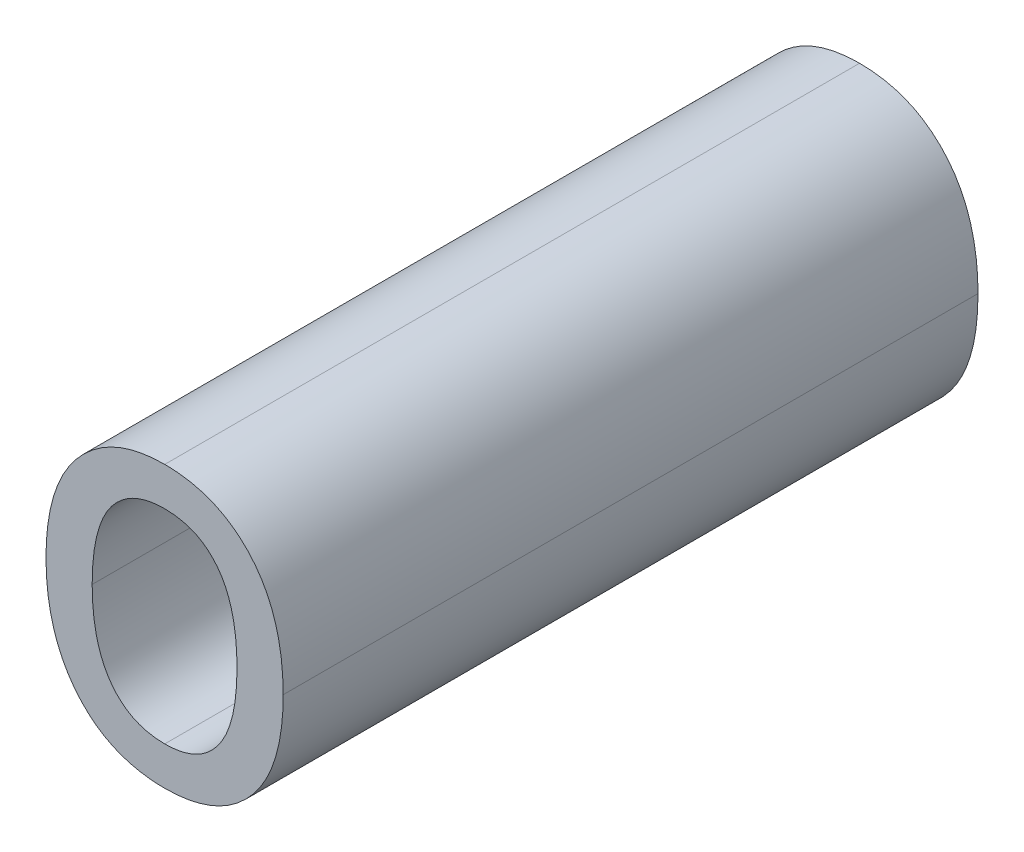
ISO-10303-21;
HEADER;
FILE_DESCRIPTION(('STEP AP214'),'2;1');
FILE_NAME('part.step','',(''),(''),'','','');
FILE_SCHEMA(('AUTOMOTIVE_DESIGN { 1 0 10303 214 1 1 1 1 }'));
ENDSEC;
DATA;
#1=APPLICATION_CONTEXT('core data for automotive mechanical design processes');
#2=APPLICATION_PROTOCOL_DEFINITION('international standard','automotive_design',2000,#1);
#3=PRODUCT_CONTEXT('',#1,'mechanical');
#4=PRODUCT('Part','Part','',(#3));
#5=PRODUCT_RELATED_PRODUCT_CATEGORY('part','',(#4));
#6=PRODUCT_DEFINITION_FORMATION('','',#4);
#7=PRODUCT_DEFINITION_CONTEXT('part definition',#1,'design');
#8=PRODUCT_DEFINITION('design','',#6,#7);
#9=PRODUCT_DEFINITION_SHAPE('','',#8);
#10=(LENGTH_UNIT() NAMED_UNIT(*) SI_UNIT(.MILLI.,.METRE.));
#11=(NAMED_UNIT(*) PLANE_ANGLE_UNIT() SI_UNIT($,.RADIAN.));
#12=(NAMED_UNIT(*) SI_UNIT($,.STERADIAN.) SOLID_ANGLE_UNIT());
#13=UNCERTAINTY_MEASURE_WITH_UNIT(LENGTH_MEASURE(1.E-05),#10,'distance_accuracy_value','');
#14=(GEOMETRIC_REPRESENTATION_CONTEXT(3) GLOBAL_UNCERTAINTY_ASSIGNED_CONTEXT((#13)) GLOBAL_UNIT_ASSIGNED_CONTEXT((#10,
#11,#12)) REPRESENTATION_CONTEXT('',''));
#15=CARTESIAN_POINT('',(0.,0.,0.));
#16=DIRECTION('',(0.,0.,1.));
#17=DIRECTION('',(1.,0.,0.));
#18=AXIS2_PLACEMENT_3D('',#15,#16,#17);
#19=CARTESIAN_POINT('',(-1.961285671734,-1.901428991533,0.));
#20=CARTESIAN_POINT('',(-1.961285671734,-1.901428991533,0.1));
#21=CARTESIAN_POINT('',(-1.956332462357,-1.901428991533,0.));
#22=CARTESIAN_POINT('',(-1.956332462357,-1.901428991533,0.1));
#23=CARTESIAN_POINT('',(-1.950883932042,-1.894123007702,0.));
#24=CARTESIAN_POINT('',(-1.950883932042,-1.894123007702,0.1));
#25=CARTESIAN_POINT('',(-1.950883932042,-1.886775747126,0.));
#26=CARTESIAN_POINT('',(-1.950883932042,-1.886775747126,0.1));
#27=B_SPLINE_SURFACE_WITH_KNOTS('',2,1,((#19,#20),(#21,#22),(#23,#24),(#25,#26)),.UNSPECIFIED.,
.F.,.F.,.F.,(3,1,3),(2,2),(0.,1.,2.),(0.,0.01),.UNSPECIFIED.);
#28=CARTESIAN_POINT('',(-1.961285671734,-1.901428991533,0.));
#29=CARTESIAN_POINT('',(-1.956332462357,-1.901428991533,0.));
#30=CARTESIAN_POINT('',(-1.950883932042,-1.894123007702,0.));
#31=CARTESIAN_POINT('',(-1.950883932042,-1.886775747126,0.));
#32=B_SPLINE_CURVE_WITH_KNOTS('',2,(#28,#29,#30,#31),.UNSPECIFIED.,.F.,.F.,(3,1,3),(0.,1.,2.),.UNSPECIFIED.);
#33=CARTESIAN_POINT('',(-1.961285671734,-1.901428991533,0.));
#34=VERTEX_POINT('',#33);
#35=CARTESIAN_POINT('',(-1.950883932042,-1.886775747126,0.));
#36=VERTEX_POINT('',#35);
#37=EDGE_CURVE('E11',#34,#36,#32,.T.);
#38=DIRECTION('',(0.,0.,1.));
#39=VECTOR('',#38,1.);
#40=CARTESIAN_POINT('',(-1.961285671734,-1.901428991533,0.));
#41=LINE('',#40,#39);
#42=CARTESIAN_POINT('',(-1.961285671734,-1.901428991533,0.1));
#43=VERTEX_POINT('',#42);
#44=EDGE_CURVE('E28',#34,#43,#41,.T.);
#45=CARTESIAN_POINT('',(-1.950883932042,-1.886775747126,0.1));
#46=CARTESIAN_POINT('',(-1.950883932042,-1.894123007702,0.1));
#47=CARTESIAN_POINT('',(-1.956332462357,-1.901428991533,0.1));
#48=CARTESIAN_POINT('',(-1.961285671734,-1.901428991533,0.1));
#49=B_SPLINE_CURVE_WITH_KNOTS('',2,(#45,#46,#47,#48),.UNSPECIFIED.,.F.,.F.,(3,1,3),(-2.,-1.,0.),.UNSPECIFIED.);
#50=CARTESIAN_POINT('',(-1.950883932042,-1.886775747126,0.1));
#51=VERTEX_POINT('',#50);
#52=EDGE_CURVE('E221',#51,#43,#49,.T.);
#53=DIRECTION('',(0.,0.,1.));
#54=VECTOR('',#53,1.);
#55=CARTESIAN_POINT('',(-1.950883932042,-1.886775747126,0.));
#56=LINE('',#55,#54);
#57=EDGE_CURVE('E41',#36,#51,#56,.T.);
#58=ORIENTED_EDGE('',*,*,#37,.F.);
#59=ORIENTED_EDGE('',*,*,#44,.T.);
#60=ORIENTED_EDGE('',*,*,#52,.F.);
#61=ORIENTED_EDGE('',*,*,#57,.F.);
#62=EDGE_LOOP('',(#58,#59,#60,#61));
#63=FACE_BOUND('',#62,.T.);
#64=ADVANCED_FACE('F17',(#63),#27,.F.);
#65=CARTESIAN_POINT('',(-1.971728688171,-1.886775747126,0.));
#66=CARTESIAN_POINT('',(-1.971728688171,-1.886775747126,0.1));
#67=CARTESIAN_POINT('',(-1.971728688171,-1.893999177468,0.));
#68=CARTESIAN_POINT('',(-1.971728688171,-1.893999177468,0.1));
#69=CARTESIAN_POINT('',(-1.966280157856,-1.901428991533,0.));
#70=CARTESIAN_POINT('',(-1.966280157856,-1.901428991533,0.1));
#71=CARTESIAN_POINT('',(-1.961285671734,-1.901428991533,0.));
#72=CARTESIAN_POINT('',(-1.961285671734,-1.901428991533,0.1));
#73=B_SPLINE_SURFACE_WITH_KNOTS('',2,1,((#65,#66),(#67,#68),(#69,#70),(#71,#72)),.UNSPECIFIED.,
.F.,.F.,.F.,(3,1,3),(2,2),(0.,1.,2.),(0.,0.01),.UNSPECIFIED.);
#74=CARTESIAN_POINT('',(-1.971728688171,-1.886775747126,0.));
#75=CARTESIAN_POINT('',(-1.971728688171,-1.893999177468,0.));
#76=CARTESIAN_POINT('',(-1.966280157856,-1.901428991533,0.));
#77=CARTESIAN_POINT('',(-1.961285671734,-1.901428991533,0.));
#78=B_SPLINE_CURVE_WITH_KNOTS('',2,(#74,#75,#76,#77),.UNSPECIFIED.,.F.,.F.,(3,1,3),(0.,1.,2.),.UNSPECIFIED.);
#79=CARTESIAN_POINT('',(-1.971728688171,-1.886775747126,0.));
#80=VERTEX_POINT('',#79);
#81=EDGE_CURVE('E212',#80,#34,#78,.T.);
#82=DIRECTION('',(0.,0.,1.));
#83=VECTOR('',#82,1.);
#84=CARTESIAN_POINT('',(-1.971728688171,-1.886775747126,0.));
#85=LINE('',#84,#83);
#86=CARTESIAN_POINT('',(-1.971728688171,-1.886775747126,0.1));
#87=VERTEX_POINT('',#86);
#88=EDGE_CURVE('E206',#80,#87,#85,.T.);
#89=CARTESIAN_POINT('',(-1.961285671734,-1.901428991533,0.1));
#90=CARTESIAN_POINT('',(-1.966280157856,-1.901428991533,0.1));
#91=CARTESIAN_POINT('',(-1.971728688171,-1.893999177468,0.1));
#92=CARTESIAN_POINT('',(-1.971728688171,-1.886775747126,0.1));
#93=B_SPLINE_CURVE_WITH_KNOTS('',2,(#89,#90,#91,#92),.UNSPECIFIED.,.F.,.F.,(3,1,3),(-2.,-1.,0.),.UNSPECIFIED.);
#94=EDGE_CURVE('E199',#43,#87,#93,.T.);
#95=ORIENTED_EDGE('',*,*,#81,.F.);
#96=ORIENTED_EDGE('',*,*,#88,.T.);
#97=ORIENTED_EDGE('',*,*,#94,.F.);
#98=ORIENTED_EDGE('',*,*,#44,.F.);
#99=EDGE_LOOP('',(#95,#96,#97,#98));
#100=FACE_BOUND('',#99,.T.);
#101=ADVANCED_FACE('F227',(#100),#73,.F.);
#102=CARTESIAN_POINT('',(-1.961285671734,-1.872122502718,0.));
#103=CARTESIAN_POINT('',(-1.961285671734,-1.872122502718,0.1));
#104=CARTESIAN_POINT('',(-1.966280157856,-1.872122502718,0.));
#105=CARTESIAN_POINT('',(-1.966280157856,-1.872122502718,0.1));
#106=CARTESIAN_POINT('',(-1.971728688171,-1.87934593306,0.));
#107=CARTESIAN_POINT('',(-1.971728688171,-1.87934593306,0.1));
#108=CARTESIAN_POINT('',(-1.971728688171,-1.886775747126,0.));
#109=CARTESIAN_POINT('',(-1.971728688171,-1.886775747126,0.1));
#110=B_SPLINE_SURFACE_WITH_KNOTS('',2,1,((#102,#103),(#104,#105),(#106,#107),(#108,#109)),
.UNSPECIFIED.,.F.,.F.,.F.,(3,1,3),(2,2),(0.,1.,2.),(0.,0.01),.UNSPECIFIED.);
#111=CARTESIAN_POINT('',(-1.961285671734,-1.872122502718,0.));
#112=CARTESIAN_POINT('',(-1.966280157856,-1.872122502718,0.));
#113=CARTESIAN_POINT('',(-1.971728688171,-1.87934593306,0.));
#114=CARTESIAN_POINT('',(-1.971728688171,-1.886775747126,0.));
#115=B_SPLINE_CURVE_WITH_KNOTS('',2,(#111,#112,#113,#114),.UNSPECIFIED.,.F.,.F.,(3,1,3),(0.,1.,
2.),.UNSPECIFIED.);
#116=CARTESIAN_POINT('',(-1.961285671734,-1.872122502718,0.));
#117=VERTEX_POINT('',#116);
#118=EDGE_CURVE('E194',#117,#80,#115,.T.);
#119=DIRECTION('',(0.,0.,1.));
#120=VECTOR('',#119,1.);
#121=CARTESIAN_POINT('',(-1.961285671734,-1.872122502718,0.));
#122=LINE('',#121,#120);
#123=CARTESIAN_POINT('',(-1.961285671734,-1.872122502718,0.1));
#124=VERTEX_POINT('',#123);
#125=EDGE_CURVE('E188',#117,#124,#122,.T.);
#126=CARTESIAN_POINT('',(-1.971728688171,-1.886775747126,0.1));
#127=CARTESIAN_POINT('',(-1.971728688171,-1.87934593306,0.1));
#128=CARTESIAN_POINT('',(-1.966280157856,-1.872122502718,0.1));
#129=CARTESIAN_POINT('',(-1.961285671734,-1.872122502718,0.1));
#130=B_SPLINE_CURVE_WITH_KNOTS('',2,(#126,#127,#128,#129),.UNSPECIFIED.,.F.,.F.,(3,1,3),(-2.,
-1.,0.),.UNSPECIFIED.);
#131=EDGE_CURVE('E181',#87,#124,#130,.T.);
#132=ORIENTED_EDGE('',*,*,#118,.F.);
#133=ORIENTED_EDGE('',*,*,#125,.T.);
#134=ORIENTED_EDGE('',*,*,#131,.F.);
#135=ORIENTED_EDGE('',*,*,#88,.F.);
#136=EDGE_LOOP('',(#132,#133,#134,#135));
#137=FACE_BOUND('',#136,.T.);
#138=ADVANCED_FACE('F237',(#137),#110,.F.);
#139=CARTESIAN_POINT('',(-1.950883932042,-1.886775747126,0.));
#140=CARTESIAN_POINT('',(-1.950883932042,-1.886775747126,0.1));
#141=CARTESIAN_POINT('',(-1.950883932042,-1.87934593306,0.));
#142=CARTESIAN_POINT('',(-1.950883932042,-1.87934593306,0.1));
#143=CARTESIAN_POINT('',(-1.956291185612,-1.872122502718,0.));
#144=CARTESIAN_POINT('',(-1.956291185612,-1.872122502718,0.1));
#145=CARTESIAN_POINT('',(-1.961285671734,-1.872122502718,0.));
#146=CARTESIAN_POINT('',(-1.961285671734,-1.872122502718,0.1));
#147=B_SPLINE_SURFACE_WITH_KNOTS('',2,1,((#139,#140),(#141,#142),(#143,#144),(#145,#146)),
.UNSPECIFIED.,.F.,.F.,.F.,(3,1,3),(2,2),(0.,1.,2.),(0.,0.01),.UNSPECIFIED.);
#148=CARTESIAN_POINT('',(-1.950883932042,-1.886775747126,0.));
#149=CARTESIAN_POINT('',(-1.950883932042,-1.87934593306,0.));
#150=CARTESIAN_POINT('',(-1.956291185612,-1.872122502718,0.));
#151=CARTESIAN_POINT('',(-1.961285671734,-1.872122502718,0.));
#152=B_SPLINE_CURVE_WITH_KNOTS('',2,(#148,#149,#150,#151),.UNSPECIFIED.,.F.,.F.,(3,1,3),(0.,1.,
2.),.UNSPECIFIED.);
#153=EDGE_CURVE('E173',#36,#117,#152,.T.);
#154=CARTESIAN_POINT('',(-1.961285671734,-1.872122502718,0.1));
#155=CARTESIAN_POINT('',(-1.956291185612,-1.872122502718,0.1));
#156=CARTESIAN_POINT('',(-1.950883932042,-1.87934593306,0.1));
#157=CARTESIAN_POINT('',(-1.950883932042,-1.886775747126,0.1));
#158=B_SPLINE_CURVE_WITH_KNOTS('',2,(#154,#155,#156,#157),.UNSPECIFIED.,.F.,.F.,(3,1,3),(-2.,
-1.,0.),.UNSPECIFIED.);
#159=EDGE_CURVE('E165',#124,#51,#158,.T.);
#160=ORIENTED_EDGE('',*,*,#153,.F.);
#161=ORIENTED_EDGE('',*,*,#57,.T.);
#162=ORIENTED_EDGE('',*,*,#159,.F.);
#163=ORIENTED_EDGE('',*,*,#125,.F.);
#164=EDGE_LOOP('',(#160,#161,#162,#163));
#165=FACE_BOUND('',#164,.T.);
#166=ADVANCED_FACE('F232',(#165),#147,.F.);
#167=CARTESIAN_POINT('',(-1.978374244085,-1.886775747126,0.));
#168=CARTESIAN_POINT('',(-1.978374244085,-1.886775747126,0.1));
#169=CARTESIAN_POINT('',(-1.978374244085,-1.896104291453,0.));
#170=CARTESIAN_POINT('',(-1.978374244085,-1.896104291453,0.1));
#171=CARTESIAN_POINT('',(-1.969252083482,-1.906960075338,0.));
#172=CARTESIAN_POINT('',(-1.969252083482,-1.906960075338,0.1));
#173=CARTESIAN_POINT('',(-1.961285671734,-1.906960075338,0.));
#174=CARTESIAN_POINT('',(-1.961285671734,-1.906960075338,0.1));
#175=B_SPLINE_SURFACE_WITH_KNOTS('',2,1,((#167,#168),(#169,#170),(#171,#172),(#173,#174)),
.UNSPECIFIED.,.F.,.F.,.F.,(3,1,3),(2,2),(-2.,-1.,0.),(0.,0.01),.UNSPECIFIED.);
#176=CARTESIAN_POINT('',(-1.961285671734,-1.906960075338,0.));
#177=CARTESIAN_POINT('',(-1.969252083482,-1.906960075338,0.));
#178=CARTESIAN_POINT('',(-1.978374244085,-1.896104291453,0.));
#179=CARTESIAN_POINT('',(-1.978374244085,-1.886775747126,0.));
#180=B_SPLINE_CURVE_WITH_KNOTS('',2,(#176,#177,#178,#179),.UNSPECIFIED.,.F.,.F.,(3,1,3),(0.,1.,
2.),.UNSPECIFIED.);
#181=CARTESIAN_POINT('',(-1.961285671734,-1.906960075338,0.));
#182=VERTEX_POINT('',#181);
#183=CARTESIAN_POINT('',(-1.978374244085,-1.886775747126,0.));
#184=VERTEX_POINT('',#183);
#185=EDGE_CURVE('E161',#182,#184,#180,.T.);
#186=DIRECTION('',(0.,0.,1.));
#187=VECTOR('',#186,1.);
#188=CARTESIAN_POINT('',(-1.961285671734,-1.906960075338,0.));
#189=LINE('',#188,#187);
#190=CARTESIAN_POINT('',(-1.961285671734,-1.906960075338,0.1));
#191=VERTEX_POINT('',#190);
#192=EDGE_CURVE('E156',#182,#191,#189,.T.);
#193=CARTESIAN_POINT('',(-1.978374244085,-1.886775747126,0.1));
#194=CARTESIAN_POINT('',(-1.978374244085,-1.896104291453,0.1));
#195=CARTESIAN_POINT('',(-1.969252083482,-1.906960075338,0.1));
#196=CARTESIAN_POINT('',(-1.961285671734,-1.906960075338,0.1));
#197=B_SPLINE_CURVE_WITH_KNOTS('',2,(#193,#194,#195,#196),.UNSPECIFIED.,.F.,.F.,(3,1,3),(-2.,
-1.,0.),.UNSPECIFIED.);
#198=CARTESIAN_POINT('',(-1.978374244085,-1.886775747126,0.1));
#199=VERTEX_POINT('',#198);
#200=EDGE_CURVE('E110',#199,#191,#197,.T.);
#201=DIRECTION('',(0.,0.,1.));
#202=VECTOR('',#201,1.);
#203=CARTESIAN_POINT('',(-1.978374244085,-1.886775747126,0.));
#204=LINE('',#203,#202);
#205=EDGE_CURVE('E147',#184,#199,#204,.T.);
#206=ORIENTED_EDGE('',*,*,#185,.F.);
#207=ORIENTED_EDGE('',*,*,#192,.T.);
#208=ORIENTED_EDGE('',*,*,#200,.F.);
#209=ORIENTED_EDGE('',*,*,#205,.F.);
#210=EDGE_LOOP('',(#206,#207,#208,#209));
#211=FACE_BOUND('',#210,.T.);
#212=ADVANCED_FACE('F245',(#211),#175,.T.);
#213=CARTESIAN_POINT('',(-1.961285671734,-1.866591418914,0.));
#214=CARTESIAN_POINT('',(-1.961285671734,-1.866591418914,0.1));
#215=CARTESIAN_POINT('',(-1.968963146269,-1.866591418914,0.));
#216=CARTESIAN_POINT('',(-1.968963146269,-1.866591418914,0.1));
#217=CARTESIAN_POINT('',(-1.978374244085,-1.87719954233,0.));
#218=CARTESIAN_POINT('',(-1.978374244085,-1.87719954233,0.1));
#219=CARTESIAN_POINT('',(-1.978374244085,-1.886775747126,0.));
#220=CARTESIAN_POINT('',(-1.978374244085,-1.886775747126,0.1));
#221=B_SPLINE_SURFACE_WITH_KNOTS('',2,1,((#213,#214),(#215,#216),(#217,#218),(#219,#220)),
.UNSPECIFIED.,.F.,.F.,.F.,(3,1,3),(2,2),(-2.,-1.,0.),(0.,0.01),.UNSPECIFIED.);
#222=CARTESIAN_POINT('',(-1.978374244085,-1.886775747126,0.));
#223=CARTESIAN_POINT('',(-1.978374244085,-1.87719954233,0.));
#224=CARTESIAN_POINT('',(-1.968963146269,-1.866591418914,0.));
#225=CARTESIAN_POINT('',(-1.961285671734,-1.866591418914,0.));
#226=B_SPLINE_CURVE_WITH_KNOTS('',2,(#222,#223,#224,#225),.UNSPECIFIED.,.F.,.F.,(3,1,3),(0.,1.,
2.),.UNSPECIFIED.);
#227=CARTESIAN_POINT('',(-1.961285671734,-1.866591418914,0.));
#228=VERTEX_POINT('',#227);
#229=EDGE_CURVE('E140',#184,#228,#226,.T.);
#230=CARTESIAN_POINT('',(-1.961285671734,-1.866591418914,0.1));
#231=CARTESIAN_POINT('',(-1.968963146269,-1.866591418914,0.1));
#232=CARTESIAN_POINT('',(-1.978374244085,-1.87719954233,0.1));
#233=CARTESIAN_POINT('',(-1.978374244085,-1.886775747126,0.1));
#234=B_SPLINE_CURVE_WITH_KNOTS('',2,(#230,#231,#232,#233),.UNSPECIFIED.,.F.,.F.,(3,1,3),(-2.,
-1.,0.),.UNSPECIFIED.);
#235=CARTESIAN_POINT('',(-1.961285671734,-1.866591418914,0.1));
#236=VERTEX_POINT('',#235);
#237=EDGE_CURVE('E136',#236,#199,#234,.T.);
#238=DIRECTION('',(0.,0.,1.));
#239=VECTOR('',#238,1.);
#240=CARTESIAN_POINT('',(-1.961285671734,-1.866591418914,0.));
#241=LINE('',#240,#239);
#242=EDGE_CURVE('E93',#228,#236,#241,.T.);
#243=ORIENTED_EDGE('',*,*,#229,.F.);
#244=ORIENTED_EDGE('',*,*,#205,.T.);
#245=ORIENTED_EDGE('',*,*,#237,.F.);
#246=ORIENTED_EDGE('',*,*,#242,.F.);
#247=EDGE_LOOP('',(#243,#244,#245,#246));
#248=FACE_BOUND('',#247,.T.);
#249=ADVANCED_FACE('F283',(#248),#221,.T.);
#250=CARTESIAN_POINT('',(-1.944238376128,-1.886775747126,0.));
#251=CARTESIAN_POINT('',(-1.944238376128,-1.886775747126,0.1));
#252=CARTESIAN_POINT('',(-1.944238376128,-1.877158265585,0.));
#253=CARTESIAN_POINT('',(-1.944238376128,-1.877158265585,0.1));
#254=CARTESIAN_POINT('',(-1.95352564371,-1.866591418914,0.));
#255=CARTESIAN_POINT('',(-1.95352564371,-1.866591418914,0.1));
#256=CARTESIAN_POINT('',(-1.961285671734,-1.866591418914,0.));
#257=CARTESIAN_POINT('',(-1.961285671734,-1.866591418914,0.1));
#258=B_SPLINE_SURFACE_WITH_KNOTS('',2,1,((#250,#251),(#252,#253),(#254,#255),(#256,#257)),
.UNSPECIFIED.,.F.,.F.,.F.,(3,1,3),(2,2),(-2.,-1.,0.),(0.,0.01),.UNSPECIFIED.);
#259=CARTESIAN_POINT('',(-1.961285671734,-1.866591418914,0.));
#260=CARTESIAN_POINT('',(-1.95352564371,-1.866591418914,0.));
#261=CARTESIAN_POINT('',(-1.944238376128,-1.877158265585,0.));
#262=CARTESIAN_POINT('',(-1.944238376128,-1.886775747126,0.));
#263=B_SPLINE_CURVE_WITH_KNOTS('',2,(#259,#260,#261,#262),.UNSPECIFIED.,.F.,.F.,(3,1,3),(0.,1.,
2.),.UNSPECIFIED.);
#264=CARTESIAN_POINT('',(-1.944238376128,-1.886775747126,0.));
#265=VERTEX_POINT('',#264);
#266=EDGE_CURVE('E97',#228,#265,#263,.T.);
#267=CARTESIAN_POINT('',(-1.944238376128,-1.886775747126,0.1));
#268=CARTESIAN_POINT('',(-1.944238376128,-1.877158265585,0.1));
#269=CARTESIAN_POINT('',(-1.95352564371,-1.866591418914,0.1));
#270=CARTESIAN_POINT('',(-1.961285671734,-1.866591418914,0.1));
#271=B_SPLINE_CURVE_WITH_KNOTS('',2,(#267,#268,#269,#270),.UNSPECIFIED.,.F.,.F.,(3,1,3),(-2.,
-1.,0.),.UNSPECIFIED.);
#272=CARTESIAN_POINT('',(-1.944238376128,-1.886775747126,0.1));
#273=VERTEX_POINT('',#272);
#274=EDGE_CURVE('E86',#273,#236,#271,.T.);
#275=DIRECTION('',(0.,0.,1.));
#276=VECTOR('',#275,1.);
#277=CARTESIAN_POINT('',(-1.944238376128,-1.886775747126,0.));
#278=LINE('',#277,#276);
#279=EDGE_CURVE('E90',#265,#273,#278,.T.);
#280=ORIENTED_EDGE('',*,*,#266,.F.);
#281=ORIENTED_EDGE('',*,*,#242,.T.);
#282=ORIENTED_EDGE('',*,*,#274,.F.);
#283=ORIENTED_EDGE('',*,*,#279,.F.);
#284=EDGE_LOOP('',(#280,#281,#282,#283));
#285=FACE_BOUND('',#284,.T.);
#286=ADVANCED_FACE('F89',(#285),#258,.T.);
#287=CARTESIAN_POINT('',(-1.961285671734,-1.906960075338,0.));
#288=CARTESIAN_POINT('',(-1.961285671734,-1.906960075338,0.1));
#289=CARTESIAN_POINT('',(-1.95352564371,-1.906960075338,0.));
#290=CARTESIAN_POINT('',(-1.95352564371,-1.906960075338,0.1));
#291=CARTESIAN_POINT('',(-1.944238376128,-1.896434505411,0.));
#292=CARTESIAN_POINT('',(-1.944238376128,-1.896434505411,0.1));
#293=CARTESIAN_POINT('',(-1.944238376128,-1.886775747126,0.));
#294=CARTESIAN_POINT('',(-1.944238376128,-1.886775747126,0.1));
#295=B_SPLINE_SURFACE_WITH_KNOTS('',2,1,((#287,#288),(#289,#290),(#291,#292),(#293,#294)),
.UNSPECIFIED.,.F.,.F.,.F.,(3,1,3),(2,2),(-2.,-1.,0.),(0.,0.01),.UNSPECIFIED.);
#296=CARTESIAN_POINT('',(-1.944238376128,-1.886775747126,0.));
#297=CARTESIAN_POINT('',(-1.944238376128,-1.896434505411,0.));
#298=CARTESIAN_POINT('',(-1.95352564371,-1.906960075338,0.));
#299=CARTESIAN_POINT('',(-1.961285671734,-1.906960075338,0.));
#300=B_SPLINE_CURVE_WITH_KNOTS('',2,(#296,#297,#298,#299),.UNSPECIFIED.,.F.,.F.,(3,1,3),(0.,1.,
2.),.UNSPECIFIED.);
#301=EDGE_CURVE('E105',#265,#182,#300,.T.);
#302=CARTESIAN_POINT('',(-1.961285671734,-1.906960075338,0.1));
#303=CARTESIAN_POINT('',(-1.95352564371,-1.906960075338,0.1));
#304=CARTESIAN_POINT('',(-1.944238376128,-1.896434505411,0.1));
#305=CARTESIAN_POINT('',(-1.944238376128,-1.886775747126,0.1));
#306=B_SPLINE_CURVE_WITH_KNOTS('',2,(#302,#303,#304,#305),.UNSPECIFIED.,.F.,.F.,(3,1,3),(-2.,
-1.,0.),.UNSPECIFIED.);
#307=EDGE_CURVE('E103',#191,#273,#306,.T.);
#308=ORIENTED_EDGE('',*,*,#301,.F.);
#309=ORIENTED_EDGE('',*,*,#279,.T.);
#310=ORIENTED_EDGE('',*,*,#307,.F.);
#311=ORIENTED_EDGE('',*,*,#192,.F.);
#312=EDGE_LOOP('',(#308,#309,#310,#311));
#313=FACE_BOUND('',#312,.T.);
#314=ADVANCED_FACE('F101',(#313),#295,.T.);
#315=CARTESIAN_POINT('',(-1.961287809029,-1.886785469597,0.));
#316=DIRECTION('',(0.,0.,1.));
#317=DIRECTION('',(1.,0.,0.));
#318=AXIS2_PLACEMENT_3D('',#315,#316,#317);
#319=PLANE('',#318);
#320=ORIENTED_EDGE('',*,*,#301,.T.);
#321=ORIENTED_EDGE('',*,*,#185,.T.);
#322=ORIENTED_EDGE('',*,*,#229,.T.);
#323=ORIENTED_EDGE('',*,*,#266,.T.);
#324=EDGE_LOOP('',(#320,#321,#322,#323));
#325=FACE_BOUND('',#324,.T.);
#326=ORIENTED_EDGE('',*,*,#37,.T.);
#327=ORIENTED_EDGE('',*,*,#153,.T.);
#328=ORIENTED_EDGE('',*,*,#118,.T.);
#329=ORIENTED_EDGE('',*,*,#81,.T.);
#330=EDGE_LOOP('',(#326,#327,#328,#329));
#331=FACE_BOUND('',#330,.T.);
#332=ADVANCED_FACE('F235',(#325,#331),#319,.F.);
#333=CARTESIAN_POINT('',(-1.961287809029,-1.886785469597,0.1));
#334=DIRECTION('',(0.,0.,1.));
#335=DIRECTION('',(1.,0.,0.));
#336=AXIS2_PLACEMENT_3D('',#333,#334,#335);
#337=PLANE('',#336);
#338=ORIENTED_EDGE('',*,*,#307,.T.);
#339=ORIENTED_EDGE('',*,*,#274,.T.);
#340=ORIENTED_EDGE('',*,*,#237,.T.);
#341=ORIENTED_EDGE('',*,*,#200,.T.);
#342=EDGE_LOOP('',(#338,#339,#340,#341));
#343=FACE_BOUND('',#342,.T.);
#344=ORIENTED_EDGE('',*,*,#52,.T.);
#345=ORIENTED_EDGE('',*,*,#94,.T.);
#346=ORIENTED_EDGE('',*,*,#131,.T.);
#347=ORIENTED_EDGE('',*,*,#159,.T.);
#348=EDGE_LOOP('',(#344,#345,#346,#347));
#349=FACE_BOUND('',#348,.T.);
#350=ADVANCED_FACE('F108',(#343,#349),#337,.T.);
#351=CLOSED_SHELL('',(#64,#101,#138,#166,#212,#249,#286,#314,#332,#350));
#352=MANIFOLD_SOLID_BREP('B1',#351);
#353=ADVANCED_BREP_SHAPE_REPRESENTATION('',(#18,#352),#14);
#354=SHAPE_DEFINITION_REPRESENTATION(#9,#353);
ENDSEC;
END-ISO-10303-21;
